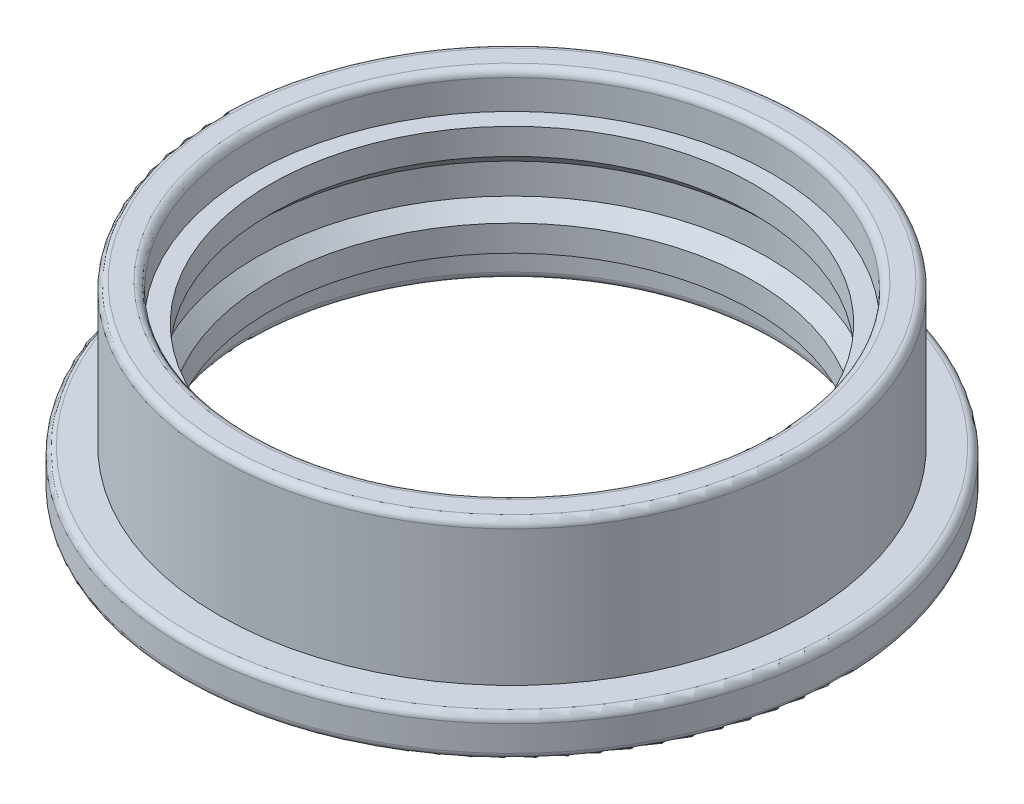
ISO-10303-21;
HEADER;
FILE_DESCRIPTION(('STEP AP214'),'2;1');
FILE_NAME('part.step','',(''),(''),'','','');
FILE_SCHEMA(('AUTOMOTIVE_DESIGN { 1 0 10303 214 1 1 1 1 }'));
ENDSEC;
DATA;
#1=APPLICATION_CONTEXT('core data for automotive mechanical design processes');
#2=APPLICATION_PROTOCOL_DEFINITION('international standard','automotive_design',2000,#1);
#3=PRODUCT_CONTEXT('',#1,'mechanical');
#4=PRODUCT('Part','Part','',(#3));
#5=PRODUCT_RELATED_PRODUCT_CATEGORY('part','',(#4));
#6=PRODUCT_DEFINITION_FORMATION('','',#4);
#7=PRODUCT_DEFINITION_CONTEXT('part definition',#1,'design');
#8=PRODUCT_DEFINITION('design','',#6,#7);
#9=PRODUCT_DEFINITION_SHAPE('','',#8);
#10=(LENGTH_UNIT() NAMED_UNIT(*) SI_UNIT(.MILLI.,.METRE.));
#11=(NAMED_UNIT(*) PLANE_ANGLE_UNIT() SI_UNIT($,.RADIAN.));
#12=(NAMED_UNIT(*) SI_UNIT($,.STERADIAN.) SOLID_ANGLE_UNIT());
#13=UNCERTAINTY_MEASURE_WITH_UNIT(LENGTH_MEASURE(1.E-05),#10,'distance_accuracy_value','');
#14=(GEOMETRIC_REPRESENTATION_CONTEXT(3) GLOBAL_UNCERTAINTY_ASSIGNED_CONTEXT((#13)) GLOBAL_UNIT_ASSIGNED_CONTEXT((#10,
#11,#12)) REPRESENTATION_CONTEXT('',''));
#15=CARTESIAN_POINT('',(0.,0.,0.));
#16=DIRECTION('',(0.,0.,1.));
#17=DIRECTION('',(1.,0.,0.));
#18=AXIS2_PLACEMENT_3D('',#15,#16,#17);
#19=CARTESIAN_POINT('',(0.,5.,0.));
#20=DIRECTION('',(0.,-1.,0.));
#21=DIRECTION('',(0.,0.,-1.));
#22=AXIS2_PLACEMENT_3D('',#19,#20,#21);
#23=CYLINDRICAL_SURFACE('',#22,6.6);
#24=CARTESIAN_POINT('',(0.,4.,0.));
#25=DIRECTION('',(0.,1.,0.));
#26=DIRECTION('',(0.,0.,1.));
#27=AXIS2_PLACEMENT_3D('',#24,#25,#26);
#28=CIRCLE('',#27,6.6);
#29=CARTESIAN_POINT('',(0.,4.,6.6));
#30=VERTEX_POINT('',#29);
#31=EDGE_CURVE('E82',#30,#30,#28,.T.);
#32=ORIENTED_EDGE('',*,*,#31,.T.);
#33=EDGE_LOOP('',(#32));
#34=FACE_BOUND('',#33,.T.);
#35=CARTESIAN_POINT('',(0.,3.28921356237309,0.));
#36=DIRECTION('',(0.,-1.,0.));
#37=DIRECTION('',(0.,0.,-1.));
#38=AXIS2_PLACEMENT_3D('',#35,#36,#37);
#39=CIRCLE('',#38,6.6);
#40=CARTESIAN_POINT('',(0.,3.28921356237309,-6.6));
#41=VERTEX_POINT('',#40);
#42=EDGE_CURVE('E70',#41,#41,#39,.T.);
#43=ORIENTED_EDGE('',*,*,#42,.T.);
#44=EDGE_LOOP('',(#43));
#45=FACE_BOUND('',#44,.T.);
#46=ADVANCED_FACE('F31',(#34,#45),#23,.F.);
#47=CARTESIAN_POINT('',(0.,1.,0.));
#48=DIRECTION('',(0.,1.,0.));
#49=DIRECTION('',(0.,0.,1.));
#50=AXIS2_PLACEMENT_3D('',#47,#48,#49);
#51=CIRCLE('',#50,6.6);
#52=CARTESIAN_POINT('',(0.,1.,6.6));
#53=VERTEX_POINT('',#52);
#54=EDGE_CURVE('E78',#53,#53,#51,.T.);
#55=ORIENTED_EDGE('',*,*,#54,.F.);
#56=EDGE_LOOP('',(#55));
#57=FACE_BOUND('',#56,.T.);
#58=CARTESIAN_POINT('',(0.,1.71078643762691,0.));
#59=DIRECTION('',(0.,1.,0.));
#60=DIRECTION('',(0.,0.,1.));
#61=AXIS2_PLACEMENT_3D('',#58,#59,#60);
#62=CIRCLE('',#61,6.6);
#63=CARTESIAN_POINT('',(0.,1.71078643762691,6.6));
#64=VERTEX_POINT('',#63);
#65=EDGE_CURVE('E74',#64,#64,#62,.T.);
#66=ORIENTED_EDGE('',*,*,#65,.T.);
#67=EDGE_LOOP('',(#66));
#68=FACE_BOUND('',#67,.T.);
#69=ADVANCED_FACE('F115',(#57,#68),#23,.F.);
#70=CARTESIAN_POINT('',(0.,5.,0.));
#71=DIRECTION('',(0.,1.,0.));
#72=DIRECTION('',(0.,0.,1.));
#73=AXIS2_PLACEMENT_3D('',#70,#71,#72);
#74=PLANE('',#73);
#75=CARTESIAN_POINT('',(0.,5.,0.));
#76=DIRECTION('',(0.,1.,0.));
#77=DIRECTION('',(0.,0.,1.));
#78=AXIS2_PLACEMENT_3D('',#75,#76,#77);
#79=CIRCLE('',#78,7.8);
#80=CARTESIAN_POINT('',(0.,5.,7.8));
#81=VERTEX_POINT('',#80);
#82=EDGE_CURVE('E42',#81,#81,#79,.T.);
#83=ORIENTED_EDGE('',*,*,#82,.T.);
#84=EDGE_LOOP('',(#83));
#85=FACE_BOUND('',#84,.T.);
#86=CARTESIAN_POINT('',(0.,5.,0.));
#87=DIRECTION('',(0.,1.,0.));
#88=DIRECTION('',(0.,0.,1.));
#89=AXIS2_PLACEMENT_3D('',#86,#87,#88);
#90=CIRCLE('',#89,7.3);
#91=CARTESIAN_POINT('',(0.,5.,7.3));
#92=VERTEX_POINT('',#91);
#93=EDGE_CURVE('E46',#92,#92,#90,.F.);
#94=ORIENTED_EDGE('',*,*,#93,.T.);
#95=EDGE_LOOP('',(#94));
#96=FACE_BOUND('',#95,.T.);
#97=ADVANCED_FACE('F121',(#85,#96),#74,.T.);
#98=CARTESIAN_POINT('',(0.,5.,0.));
#99=DIRECTION('',(0.,-1.,0.));
#100=DIRECTION('',(0.,0.,-1.));
#101=AXIS2_PLACEMENT_3D('',#98,#99,#100);
#102=CYLINDRICAL_SURFACE('',#101,9.);
#103=CARTESIAN_POINT('',(0.,0.2,0.));
#104=DIRECTION('',(0.,1.,0.));
#105=DIRECTION('',(0.,0.,1.));
#106=AXIS2_PLACEMENT_3D('',#103,#104,#105);
#107=CIRCLE('',#106,9.);
#108=CARTESIAN_POINT('',(0.,0.2,9.));
#109=VERTEX_POINT('',#108);
#110=EDGE_CURVE('E54',#109,#109,#107,.T.);
#111=ORIENTED_EDGE('',*,*,#110,.T.);
#112=EDGE_LOOP('',(#111));
#113=FACE_BOUND('',#112,.T.);
#114=CARTESIAN_POINT('',(0.,0.900000000000001,0.));
#115=DIRECTION('',(0.,1.,0.));
#116=DIRECTION('',(0.,0.,1.));
#117=AXIS2_PLACEMENT_3D('',#114,#115,#116);
#118=CIRCLE('',#117,9.);
#119=CARTESIAN_POINT('',(0.,0.900000000000001,9.));
#120=VERTEX_POINT('',#119);
#121=EDGE_CURVE('E57',#120,#120,#118,.F.);
#122=ORIENTED_EDGE('',*,*,#121,.T.);
#123=EDGE_LOOP('',(#122));
#124=FACE_BOUND('',#123,.T.);
#125=ADVANCED_FACE('F130',(#113,#124),#102,.T.);
#126=CARTESIAN_POINT('',(0.,0.,0.));
#127=DIRECTION('',(0.,1.,0.));
#128=DIRECTION('',(0.,0.,1.));
#129=AXIS2_PLACEMENT_3D('',#126,#127,#128);
#130=PLANE('',#129);
#131=CARTESIAN_POINT('',(0.,0.,0.));
#132=DIRECTION('',(0.,1.,0.));
#133=DIRECTION('',(0.,0.,1.));
#134=AXIS2_PLACEMENT_3D('',#131,#132,#133);
#135=CIRCLE('',#134,7.3);
#136=CARTESIAN_POINT('',(0.,0.,7.3));
#137=VERTEX_POINT('',#136);
#138=EDGE_CURVE('E63',#137,#137,#135,.T.);
#139=ORIENTED_EDGE('',*,*,#138,.T.);
#140=EDGE_LOOP('',(#139));
#141=FACE_BOUND('',#140,.T.);
#142=CARTESIAN_POINT('',(0.,0.,0.));
#143=DIRECTION('',(0.,1.,0.));
#144=DIRECTION('',(0.,0.,1.));
#145=AXIS2_PLACEMENT_3D('',#142,#143,#144);
#146=CIRCLE('',#145,8.8);
#147=CARTESIAN_POINT('',(0.,0.,8.8));
#148=VERTEX_POINT('',#147);
#149=EDGE_CURVE('E66',#148,#148,#146,.F.);
#150=ORIENTED_EDGE('',*,*,#149,.T.);
#151=EDGE_LOOP('',(#150));
#152=FACE_BOUND('',#151,.T.);
#153=ADVANCED_FACE('F132',(#141,#152),#130,.F.);
#154=CARTESIAN_POINT('',(0.,1.1,0.));
#155=DIRECTION('',(0.,1.,0.));
#156=DIRECTION('',(0.,0.,1.));
#157=AXIS2_PLACEMENT_3D('',#154,#155,#156);
#158=PLANE('',#157);
#159=CARTESIAN_POINT('',(0.,1.1,0.));
#160=DIRECTION('',(0.,1.,0.));
#161=DIRECTION('',(0.,0.,1.));
#162=AXIS2_PLACEMENT_3D('',#159,#160,#161);
#163=CIRCLE('',#162,8.8);
#164=CARTESIAN_POINT('',(0.,1.1,8.8));
#165=VERTEX_POINT('',#164);
#166=EDGE_CURVE('E51',#165,#165,#163,.T.);
#167=ORIENTED_EDGE('',*,*,#166,.T.);
#168=EDGE_LOOP('',(#167));
#169=FACE_BOUND('',#168,.T.);
#170=CARTESIAN_POINT('',(0.,1.1,0.));
#171=DIRECTION('',(0.,1.,0.));
#172=DIRECTION('',(0.,0.,1.));
#173=AXIS2_PLACEMENT_3D('',#170,#171,#172);
#174=CIRCLE('',#173,8.);
#175=CARTESIAN_POINT('',(0.,1.1,8.));
#176=VERTEX_POINT('',#175);
#177=EDGE_CURVE('E69',#176,#176,#174,.T.);
#178=ORIENTED_EDGE('',*,*,#177,.F.);
#179=EDGE_LOOP('',(#178));
#180=FACE_BOUND('',#179,.T.);
#181=ADVANCED_FACE('F126',(#169,#180),#158,.T.);
#182=CARTESIAN_POINT('',(0.,1.1,0.));
#183=DIRECTION('',(0.,1.,0.));
#184=DIRECTION('',(0.,0.,1.));
#185=AXIS2_PLACEMENT_3D('',#182,#183,#184);
#186=CYLINDRICAL_SURFACE('',#185,8.);
#187=CARTESIAN_POINT('',(0.,4.8,0.));
#188=DIRECTION('',(0.,1.,0.));
#189=DIRECTION('',(0.,0.,1.));
#190=AXIS2_PLACEMENT_3D('',#187,#188,#189);
#191=CIRCLE('',#190,8.);
#192=CARTESIAN_POINT('',(0.,4.8,8.));
#193=VERTEX_POINT('',#192);
#194=EDGE_CURVE('E38',#193,#193,#191,.F.);
#195=ORIENTED_EDGE('',*,*,#194,.T.);
#196=EDGE_LOOP('',(#195));
#197=FACE_BOUND('',#196,.T.);
#198=ORIENTED_EDGE('',*,*,#177,.T.);
#199=EDGE_LOOP('',(#198));
#200=FACE_BOUND('',#199,.T.);
#201=ADVANCED_FACE('F208',(#197,#200),#186,.T.);
#202=CARTESIAN_POINT('',(0.,4.,0.));
#203=DIRECTION('',(0.,1.,0.));
#204=DIRECTION('',(0.,0.,1.));
#205=AXIS2_PLACEMENT_3D('',#202,#203,#204);
#206=CYLINDRICAL_SURFACE('',#205,7.1);
#207=CARTESIAN_POINT('',(0.,4.8,0.));
#208=DIRECTION('',(0.,1.,0.));
#209=DIRECTION('',(0.,0.,1.));
#210=AXIS2_PLACEMENT_3D('',#207,#208,#209);
#211=CIRCLE('',#210,7.1);
#212=CARTESIAN_POINT('',(0.,4.8,7.1));
#213=VERTEX_POINT('',#212);
#214=EDGE_CURVE('E10',#213,#213,#211,.T.);
#215=ORIENTED_EDGE('',*,*,#214,.T.);
#216=EDGE_LOOP('',(#215));
#217=FACE_BOUND('',#216,.T.);
#218=CARTESIAN_POINT('',(0.,4.,0.));
#219=DIRECTION('',(0.,1.,0.));
#220=DIRECTION('',(0.,0.,1.));
#221=AXIS2_PLACEMENT_3D('',#218,#219,#220);
#222=CIRCLE('',#221,7.1);
#223=CARTESIAN_POINT('',(0.,4.,7.1));
#224=VERTEX_POINT('',#223);
#225=EDGE_CURVE('E81',#224,#224,#222,.T.);
#226=ORIENTED_EDGE('',*,*,#225,.F.);
#227=EDGE_LOOP('',(#226));
#228=FACE_BOUND('',#227,.T.);
#229=ADVANCED_FACE('F203',(#217,#228),#206,.F.);
#230=CARTESIAN_POINT('',(0.,4.,0.));
#231=DIRECTION('',(0.,1.,0.));
#232=DIRECTION('',(0.,0.,1.));
#233=AXIS2_PLACEMENT_3D('',#230,#231,#232);
#234=PLANE('',#233);
#235=ORIENTED_EDGE('',*,*,#31,.F.);
#236=EDGE_LOOP('',(#235));
#237=FACE_BOUND('',#236,.T.);
#238=ORIENTED_EDGE('',*,*,#225,.T.);
#239=EDGE_LOOP('',(#238));
#240=FACE_BOUND('',#239,.T.);
#241=ADVANCED_FACE('F193',(#237,#240),#234,.T.);
#242=CARTESIAN_POINT('',(0.,0.,0.));
#243=DIRECTION('',(0.,1.,0.));
#244=DIRECTION('',(0.,0.,1.));
#245=AXIS2_PLACEMENT_3D('',#242,#243,#244);
#246=CYLINDRICAL_SURFACE('',#245,7.1);
#247=CARTESIAN_POINT('',(0.,0.2,0.));
#248=DIRECTION('',(0.,1.,0.));
#249=DIRECTION('',(0.,0.,1.));
#250=AXIS2_PLACEMENT_3D('',#247,#248,#249);
#251=CIRCLE('',#250,7.1);
#252=CARTESIAN_POINT('',(0.,0.2,7.1));
#253=VERTEX_POINT('',#252);
#254=EDGE_CURVE('E60',#253,#253,#251,.F.);
#255=ORIENTED_EDGE('',*,*,#254,.T.);
#256=EDGE_LOOP('',(#255));
#257=FACE_BOUND('',#256,.T.);
#258=CARTESIAN_POINT('',(0.,1.,0.));
#259=DIRECTION('',(0.,1.,0.));
#260=DIRECTION('',(0.,0.,1.));
#261=AXIS2_PLACEMENT_3D('',#258,#259,#260);
#262=CIRCLE('',#261,7.1);
#263=CARTESIAN_POINT('',(0.,1.,7.1));
#264=VERTEX_POINT('',#263);
#265=EDGE_CURVE('E73',#264,#264,#262,.T.);
#266=ORIENTED_EDGE('',*,*,#265,.T.);
#267=EDGE_LOOP('',(#266));
#268=FACE_BOUND('',#267,.T.);
#269=ADVANCED_FACE('F187',(#257,#268),#246,.F.);
#270=CARTESIAN_POINT('',(0.,1.,0.));
#271=DIRECTION('',(0.,1.,0.));
#272=DIRECTION('',(0.,0.,1.));
#273=AXIS2_PLACEMENT_3D('',#270,#271,#272);
#274=PLANE('',#273);
#275=ORIENTED_EDGE('',*,*,#54,.T.);
#276=EDGE_LOOP('',(#275));
#277=FACE_BOUND('',#276,.T.);
#278=ORIENTED_EDGE('',*,*,#265,.F.);
#279=EDGE_LOOP('',(#278));
#280=FACE_BOUND('',#279,.T.);
#281=ADVANCED_FACE('F192',(#277,#280),#274,.F.);
#282=CARTESIAN_POINT('',(0.,4.,0.));
#283=DIRECTION('',(0.,-1.,0.));
#284=DIRECTION('',(0.,0.,-1.));
#285=AXIS2_PLACEMENT_3D('',#282,#283,#284);
#286=CONICAL_SURFACE('',#285,5.8892135623731,0.785398163397448);
#287=ORIENTED_EDGE('',*,*,#42,.F.);
#288=EDGE_LOOP('',(#287));
#289=FACE_BOUND('',#288,.T.);
#290=CARTESIAN_POINT('',(0.,2.91421356237309,0.));
#291=DIRECTION('',(0.,-1.,0.));
#292=DIRECTION('',(0.,0.,-1.));
#293=AXIS2_PLACEMENT_3D('',#290,#291,#292);
#294=CIRCLE('',#293,6.975);
#295=CARTESIAN_POINT('',(0.,2.91421356237309,-6.975));
#296=VERTEX_POINT('',#295);
#297=EDGE_CURVE('E93',#296,#296,#294,.T.);
#298=ORIENTED_EDGE('',*,*,#297,.T.);
#299=EDGE_LOOP('',(#298));
#300=FACE_BOUND('',#299,.T.);
#301=ADVANCED_FACE('F97',(#289,#300),#286,.F.);
#302=CARTESIAN_POINT('',(0.,2.08578643762691,0.));
#303=DIRECTION('',(0.,1.,0.));
#304=DIRECTION('',(0.,0.,1.));
#305=AXIS2_PLACEMENT_3D('',#302,#303,#304);
#306=CONICAL_SURFACE('',#305,6.975,0.785398163397448);
#307=ORIENTED_EDGE('',*,*,#65,.F.);
#308=EDGE_LOOP('',(#307));
#309=FACE_BOUND('',#308,.T.);
#310=CARTESIAN_POINT('',(0.,2.08578643762691,0.));
#311=DIRECTION('',(0.,-1.,0.));
#312=DIRECTION('',(0.,0.,-1.));
#313=AXIS2_PLACEMENT_3D('',#310,#311,#312);
#314=CIRCLE('',#313,6.975);
#315=CARTESIAN_POINT('',(0.,2.08578643762691,-6.975));
#316=VERTEX_POINT('',#315);
#317=EDGE_CURVE('E77',#316,#316,#314,.T.);
#318=ORIENTED_EDGE('',*,*,#317,.F.);
#319=EDGE_LOOP('',(#318));
#320=FACE_BOUND('',#319,.T.);
#321=ADVANCED_FACE('F102',(#309,#320),#306,.F.);
#322=CARTESIAN_POINT('',(0.,0.,0.));
#323=DIRECTION('',(0.,-1.,0.));
#324=DIRECTION('',(0.,0.,-1.));
#325=AXIS2_PLACEMENT_3D('',#322,#323,#324);
#326=CYLINDRICAL_SURFACE('',#325,6.975);
#327=ORIENTED_EDGE('',*,*,#317,.T.);
#328=EDGE_LOOP('',(#327));
#329=FACE_BOUND('',#328,.T.);
#330=ORIENTED_EDGE('',*,*,#297,.F.);
#331=EDGE_LOOP('',(#330));
#332=FACE_BOUND('',#331,.T.);
#333=ADVANCED_FACE('F99',(#329,#332),#326,.F.);
#334=CARTESIAN_POINT('',(0.,0.2,0.));
#335=DIRECTION('',(0.,1.,0.));
#336=DIRECTION('',(0.,0.,1.));
#337=AXIS2_PLACEMENT_3D('',#334,#335,#336);
#338=TOROIDAL_SURFACE('',#337,7.3,0.2);
#339=ORIENTED_EDGE('',*,*,#254,.F.);
#340=EDGE_LOOP('',(#339));
#341=FACE_BOUND('',#340,.T.);
#342=ORIENTED_EDGE('',*,*,#138,.F.);
#343=EDGE_LOOP('',(#342));
#344=FACE_BOUND('',#343,.T.);
#345=ADVANCED_FACE('F101',(#341,#344),#338,.T.);
#346=CARTESIAN_POINT('',(0.,0.2,0.));
#347=DIRECTION('',(0.,1.,0.));
#348=DIRECTION('',(0.,0.,1.));
#349=AXIS2_PLACEMENT_3D('',#346,#347,#348);
#350=TOROIDAL_SURFACE('',#349,8.8,0.2);
#351=ORIENTED_EDGE('',*,*,#149,.F.);
#352=EDGE_LOOP('',(#351));
#353=FACE_BOUND('',#352,.T.);
#354=ORIENTED_EDGE('',*,*,#110,.F.);
#355=EDGE_LOOP('',(#354));
#356=FACE_BOUND('',#355,.T.);
#357=ADVANCED_FACE('F109',(#353,#356),#350,.T.);
#358=CARTESIAN_POINT('',(0.,0.900000000000001,0.));
#359=DIRECTION('',(0.,1.,0.));
#360=DIRECTION('',(0.,0.,1.));
#361=AXIS2_PLACEMENT_3D('',#358,#359,#360);
#362=TOROIDAL_SURFACE('',#361,8.8,0.2);
#363=ORIENTED_EDGE('',*,*,#121,.F.);
#364=EDGE_LOOP('',(#363));
#365=FACE_BOUND('',#364,.T.);
#366=ORIENTED_EDGE('',*,*,#166,.F.);
#367=EDGE_LOOP('',(#366));
#368=FACE_BOUND('',#367,.T.);
#369=ADVANCED_FACE('F141',(#365,#368),#362,.T.);
#370=CARTESIAN_POINT('',(0.,4.8,0.));
#371=DIRECTION('',(0.,1.,0.));
#372=DIRECTION('',(0.,0.,1.));
#373=AXIS2_PLACEMENT_3D('',#370,#371,#372);
#374=TOROIDAL_SURFACE('',#373,7.8,0.2);
#375=ORIENTED_EDGE('',*,*,#194,.F.);
#376=EDGE_LOOP('',(#375));
#377=FACE_BOUND('',#376,.T.);
#378=ORIENTED_EDGE('',*,*,#82,.F.);
#379=EDGE_LOOP('',(#378));
#380=FACE_BOUND('',#379,.T.);
#381=ADVANCED_FACE('F144',(#377,#380),#374,.T.);
#382=CARTESIAN_POINT('',(0.,4.8,0.));
#383=DIRECTION('',(0.,1.,0.));
#384=DIRECTION('',(0.,0.,1.));
#385=AXIS2_PLACEMENT_3D('',#382,#383,#384);
#386=TOROIDAL_SURFACE('',#385,7.3,0.2);
#387=ORIENTED_EDGE('',*,*,#93,.F.);
#388=EDGE_LOOP('',(#387));
#389=FACE_BOUND('',#388,.T.);
#390=ORIENTED_EDGE('',*,*,#214,.F.);
#391=EDGE_LOOP('',(#390));
#392=FACE_BOUND('',#391,.T.);
#393=ADVANCED_FACE('F33',(#389,#392),#386,.T.);
#394=CLOSED_SHELL('',(#46,#69,#97,#125,#153,#181,#201,#229,#241,#269,#281,#301,#321,#333,#345,
#357,#369,#381,#393));
#395=MANIFOLD_SOLID_BREP('B2',#394);
#396=ADVANCED_BREP_SHAPE_REPRESENTATION('',(#18,#395),#14);
#397=SHAPE_DEFINITION_REPRESENTATION(#9,#396);
ENDSEC;
END-ISO-10303-21;
